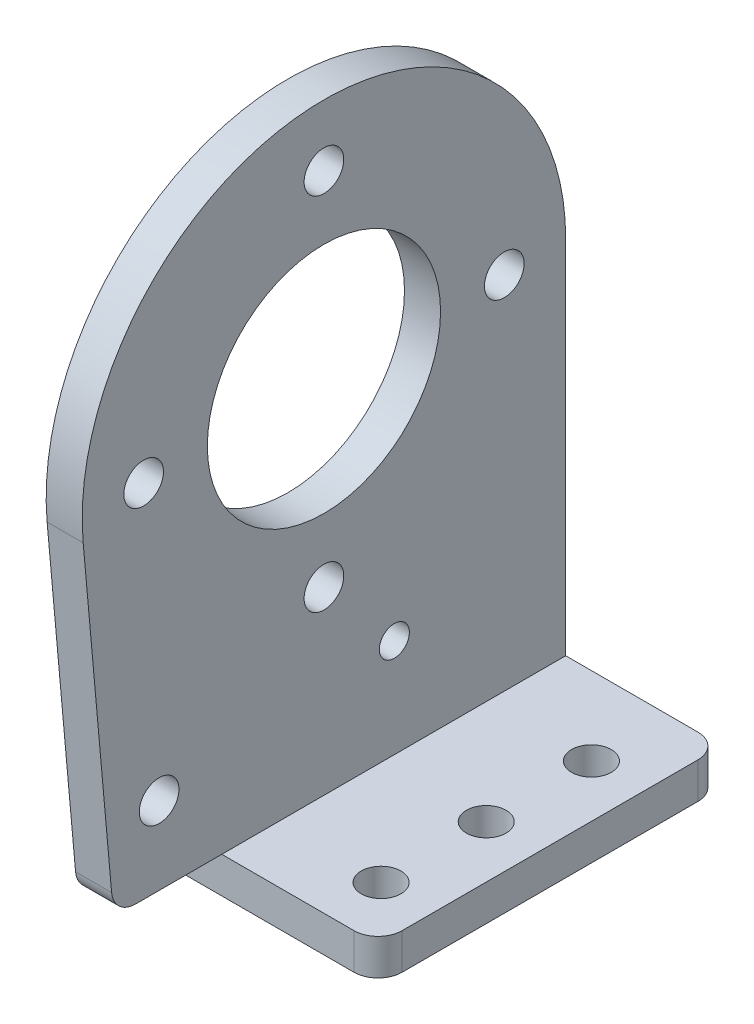
ISO-10303-21;
HEADER;
FILE_DESCRIPTION(('STEP AP214'),'2;1');
FILE_NAME('part.step','',(''),(''),'','','');
FILE_SCHEMA(('AUTOMOTIVE_DESIGN { 1 0 10303 214 1 1 1 1 }'));
ENDSEC;
DATA;
#1=APPLICATION_CONTEXT('core data for automotive mechanical design processes');
#2=APPLICATION_PROTOCOL_DEFINITION('international standard','automotive_design',2000,#1);
#3=PRODUCT_CONTEXT('',#1,'mechanical');
#4=PRODUCT('Part','Part','',(#3));
#5=PRODUCT_RELATED_PRODUCT_CATEGORY('part','',(#4));
#6=PRODUCT_DEFINITION_FORMATION('','',#4);
#7=PRODUCT_DEFINITION_CONTEXT('part definition',#1,'design');
#8=PRODUCT_DEFINITION('design','',#6,#7);
#9=PRODUCT_DEFINITION_SHAPE('','',#8);
#10=(LENGTH_UNIT() NAMED_UNIT(*) SI_UNIT(.MILLI.,.METRE.));
#11=(NAMED_UNIT(*) PLANE_ANGLE_UNIT() SI_UNIT($,.RADIAN.));
#12=(NAMED_UNIT(*) SI_UNIT($,.STERADIAN.) SOLID_ANGLE_UNIT());
#13=UNCERTAINTY_MEASURE_WITH_UNIT(LENGTH_MEASURE(1.E-05),#10,'distance_accuracy_value','');
#14=(GEOMETRIC_REPRESENTATION_CONTEXT(3) GLOBAL_UNCERTAINTY_ASSIGNED_CONTEXT((#13)) GLOBAL_UNIT_ASSIGNED_CONTEXT((#10,
#11,#12)) REPRESENTATION_CONTEXT('',''));
#15=CARTESIAN_POINT('',(0.,0.,0.));
#16=DIRECTION('',(0.,0.,1.));
#17=DIRECTION('',(1.,0.,0.));
#18=AXIS2_PLACEMENT_3D('',#15,#16,#17);
#19=CARTESIAN_POINT('',(16.,10.,0.));
#20=DIRECTION('',(0.,-1.,0.));
#21=DIRECTION('',(0.,0.,-1.));
#22=AXIS2_PLACEMENT_3D('',#19,#20,#21);
#23=PLANE('',#22);
#24=CARTESIAN_POINT('',(11.65,10.,-22.35));
#25=DIRECTION('',(0.,-1.,0.));
#26=DIRECTION('',(0.,0.,-1.));
#27=AXIS2_PLACEMENT_3D('',#24,#25,#26);
#28=CIRCLE('',#27,1.65);
#29=CARTESIAN_POINT('',(11.65,10.,-24.));
#30=VERTEX_POINT('',#29);
#31=EDGE_CURVE('E210',#30,#30,#28,.F.);
#32=ORIENTED_EDGE('',*,*,#31,.T.);
#33=EDGE_LOOP('',(#32));
#34=FACE_BOUND('',#33,.T.);
#35=CARTESIAN_POINT('',(11.65,10.,-13.6));
#36=DIRECTION('',(0.,-1.,0.));
#37=DIRECTION('',(0.,0.,-1.));
#38=AXIS2_PLACEMENT_3D('',#35,#36,#37);
#39=CIRCLE('',#38,1.65);
#40=CARTESIAN_POINT('',(11.65,10.,-15.25));
#41=VERTEX_POINT('',#40);
#42=EDGE_CURVE('E202',#41,#41,#39,.F.);
#43=ORIENTED_EDGE('',*,*,#42,.T.);
#44=EDGE_LOOP('',(#43));
#45=FACE_BOUND('',#44,.T.);
#46=DIRECTION('',(-1.,0.,0.));
#47=VECTOR('',#46,1.);
#48=CARTESIAN_POINT('',(16.,9.99999999999999,-37.61033589));
#49=LINE('',#48,#47);
#50=CARTESIAN_POINT('',(14.,9.99999999999999,-37.61033589));
#51=VERTEX_POINT('',#50);
#52=CARTESIAN_POINT('',(0.,9.99999999999999,-37.61033589));
#53=VERTEX_POINT('',#52);
#54=EDGE_CURVE('E230',#51,#53,#49,.T.);
#55=ORIENTED_EDGE('',*,*,#54,.F.);
#56=CARTESIAN_POINT('',(14.,9.99999999999999,-35.61033589));
#57=DIRECTION('',(0.,-1.,0.));
#58=DIRECTION('',(0.,0.,-1.));
#59=AXIS2_PLACEMENT_3D('',#56,#57,#58);
#60=CIRCLE('',#59,2.);
#61=CARTESIAN_POINT('',(16.,9.99999999999999,-35.61033589));
#62=VERTEX_POINT('',#61);
#63=EDGE_CURVE('E248',#51,#62,#60,.T.);
#64=ORIENTED_EDGE('',*,*,#63,.T.);
#65=DIRECTION('',(0.,0.,1.));
#66=VECTOR('',#65,1.);
#67=CARTESIAN_POINT('',(16.,10.,0.));
#68=LINE('',#67,#66);
#69=CARTESIAN_POINT('',(16.,10.,-11.));
#70=VERTEX_POINT('',#69);
#71=EDGE_CURVE('E214',#62,#70,#68,.T.);
#72=ORIENTED_EDGE('',*,*,#71,.T.);
#73=CARTESIAN_POINT('',(14.,10.,-11.));
#74=DIRECTION('',(0.,-1.,0.));
#75=DIRECTION('',(0.,0.,-1.));
#76=AXIS2_PLACEMENT_3D('',#73,#74,#75);
#77=CIRCLE('',#76,2.);
#78=CARTESIAN_POINT('',(14.,10.,-9.));
#79=VERTEX_POINT('',#78);
#80=EDGE_CURVE('E246',#70,#79,#77,.T.);
#81=ORIENTED_EDGE('',*,*,#80,.T.);
#82=DIRECTION('',(-1.,0.,0.));
#83=VECTOR('',#82,1.);
#84=CARTESIAN_POINT('',(16.,10.,-9.));
#85=LINE('',#84,#83);
#86=CARTESIAN_POINT('',(0.,10.,-9.));
#87=VERTEX_POINT('',#86);
#88=EDGE_CURVE('E232',#79,#87,#85,.T.);
#89=ORIENTED_EDGE('',*,*,#88,.T.);
#90=DIRECTION('',(0.,0.,1.));
#91=VECTOR('',#90,1.);
#92=CARTESIAN_POINT('',(0.,10.,0.));
#93=LINE('',#92,#91);
#94=EDGE_CURVE('E222',#53,#87,#93,.T.);
#95=ORIENTED_EDGE('',*,*,#94,.F.);
#96=EDGE_LOOP('',(#55,#64,#72,#81,#89,#95));
#97=FACE_BOUND('',#96,.T.);
#98=CARTESIAN_POINT('',(11.65,9.99999999999999,-31.1));
#99=DIRECTION('',(0.,-1.,0.));
#100=DIRECTION('',(0.,0.,-1.));
#101=AXIS2_PLACEMENT_3D('',#98,#99,#100);
#102=CIRCLE('',#101,1.65);
#103=CARTESIAN_POINT('',(11.65,9.99999999999999,-32.75));
#104=VERTEX_POINT('',#103);
#105=EDGE_CURVE('E207',#104,#104,#102,.T.);
#106=ORIENTED_EDGE('',*,*,#105,.F.);
#107=EDGE_LOOP('',(#106));
#108=FACE_BOUND('',#107,.T.);
#109=ADVANCED_FACE('F37',(#34,#45,#97,#108),#23,.T.);
#110=CARTESIAN_POINT('',(16.,13.,0.));
#111=DIRECTION('',(0.,1.,0.));
#112=DIRECTION('',(0.,0.,1.));
#113=AXIS2_PLACEMENT_3D('',#110,#111,#112);
#114=PLANE('',#113);
#115=DIRECTION('',(0.,0.,-1.));
#116=VECTOR('',#115,1.);
#117=CARTESIAN_POINT('',(16.,13.,0.));
#118=LINE('',#117,#116);
#119=CARTESIAN_POINT('',(16.,13.,-11.));
#120=VERTEX_POINT('',#119);
#121=CARTESIAN_POINT('',(16.,13.,-35.61033589));
#122=VERTEX_POINT('',#121);
#123=EDGE_CURVE('E217',#120,#122,#118,.T.);
#124=ORIENTED_EDGE('',*,*,#123,.T.);
#125=CARTESIAN_POINT('',(14.,13.,-35.61033589));
#126=DIRECTION('',(0.,1.,0.));
#127=DIRECTION('',(0.,0.,1.));
#128=AXIS2_PLACEMENT_3D('',#125,#126,#127);
#129=CIRCLE('',#128,2.);
#130=CARTESIAN_POINT('',(14.,13.,-37.61033589));
#131=VERTEX_POINT('',#130);
#132=EDGE_CURVE('E45',#122,#131,#129,.T.);
#133=ORIENTED_EDGE('',*,*,#132,.T.);
#134=DIRECTION('',(-1.,0.,0.));
#135=VECTOR('',#134,1.);
#136=CARTESIAN_POINT('',(16.,13.,-37.61033589));
#137=LINE('',#136,#135);
#138=CARTESIAN_POINT('',(3.,13.,-37.61033589));
#139=VERTEX_POINT('',#138);
#140=EDGE_CURVE('E228',#131,#139,#137,.T.);
#141=ORIENTED_EDGE('',*,*,#140,.T.);
#142=DIRECTION('',(0.,0.,-1.));
#143=VECTOR('',#142,1.);
#144=CARTESIAN_POINT('',(3.,13.,0.));
#145=LINE('',#144,#143);
#146=CARTESIAN_POINT('',(3.,13.,-9.));
#147=VERTEX_POINT('',#146);
#148=EDGE_CURVE('E147',#147,#139,#145,.T.);
#149=ORIENTED_EDGE('',*,*,#148,.F.);
#150=DIRECTION('',(-1.,0.,0.));
#151=VECTOR('',#150,1.);
#152=CARTESIAN_POINT('',(16.,13.,-9.));
#153=LINE('',#152,#151);
#154=CARTESIAN_POINT('',(14.,13.,-9.));
#155=VERTEX_POINT('',#154);
#156=EDGE_CURVE('E226',#155,#147,#153,.T.);
#157=ORIENTED_EDGE('',*,*,#156,.F.);
#158=CARTESIAN_POINT('',(14.,13.,-11.));
#159=DIRECTION('',(0.,1.,0.));
#160=DIRECTION('',(0.,0.,1.));
#161=AXIS2_PLACEMENT_3D('',#158,#159,#160);
#162=CIRCLE('',#161,2.);
#163=EDGE_CURVE('E52',#155,#120,#162,.T.);
#164=ORIENTED_EDGE('',*,*,#163,.T.);
#165=EDGE_LOOP('',(#124,#133,#141,#149,#157,#164));
#166=FACE_BOUND('',#165,.T.);
#167=CARTESIAN_POINT('',(11.65,13.,-22.35));
#168=DIRECTION('',(0.,-1.,0.));
#169=DIRECTION('',(0.,0.,-1.));
#170=AXIS2_PLACEMENT_3D('',#167,#168,#169);
#171=CIRCLE('',#170,1.65);
#172=CARTESIAN_POINT('',(11.65,13.,-24.));
#173=VERTEX_POINT('',#172);
#174=EDGE_CURVE('E194',#173,#173,#171,.T.);
#175=ORIENTED_EDGE('',*,*,#174,.T.);
#176=EDGE_LOOP('',(#175));
#177=FACE_BOUND('',#176,.T.);
#178=CARTESIAN_POINT('',(11.65,13.,-13.6));
#179=DIRECTION('',(0.,1.,0.));
#180=DIRECTION('',(0.,0.,1.));
#181=AXIS2_PLACEMENT_3D('',#178,#179,#180);
#182=CIRCLE('',#181,1.65);
#183=CARTESIAN_POINT('',(11.65,13.,-11.95));
#184=VERTEX_POINT('',#183);
#185=EDGE_CURVE('E199',#184,#184,#182,.F.);
#186=ORIENTED_EDGE('',*,*,#185,.T.);
#187=EDGE_LOOP('',(#186));
#188=FACE_BOUND('',#187,.T.);
#189=CARTESIAN_POINT('',(11.65,13.,-31.1));
#190=DIRECTION('',(0.,1.,0.));
#191=DIRECTION('',(0.,0.,1.));
#192=AXIS2_PLACEMENT_3D('',#189,#190,#191);
#193=CIRCLE('',#192,1.65);
#194=CARTESIAN_POINT('',(11.65,13.,-29.45));
#195=VERTEX_POINT('',#194);
#196=EDGE_CURVE('E198',#195,#195,#193,.T.);
#197=ORIENTED_EDGE('',*,*,#196,.F.);
#198=EDGE_LOOP('',(#197));
#199=FACE_BOUND('',#198,.T.);
#200=ADVANCED_FACE('F255',(#166,#177,#188,#199),#114,.T.);
#201=CARTESIAN_POINT('',(16.,0.,-9.));
#202=DIRECTION('',(0.,0.,1.));
#203=DIRECTION('',(1.,0.,0.));
#204=AXIS2_PLACEMENT_3D('',#201,#202,#203);
#205=PLANE('',#204);
#206=ORIENTED_EDGE('',*,*,#88,.F.);
#207=DIRECTION('',(0.,1.,0.));
#208=VECTOR('',#207,1.);
#209=CARTESIAN_POINT('',(14.,0.,-9.));
#210=LINE('',#209,#208);
#211=EDGE_CURVE('E11',#79,#155,#210,.T.);
#212=ORIENTED_EDGE('',*,*,#211,.T.);
#213=ORIENTED_EDGE('',*,*,#156,.T.);
#214=CARTESIAN_POINT('',(0.,13.,-9.));
#215=VERTEX_POINT('',#214);
#216=EDGE_CURVE('E219',#147,#215,#153,.T.);
#217=ORIENTED_EDGE('',*,*,#216,.T.);
#218=DIRECTION('',(0.,1.,0.));
#219=VECTOR('',#218,1.);
#220=CARTESIAN_POINT('',(0.,0.,-9.));
#221=LINE('',#220,#219);
#222=EDGE_CURVE('E213',#87,#215,#221,.T.);
#223=ORIENTED_EDGE('',*,*,#222,.F.);
#224=EDGE_LOOP('',(#206,#212,#213,#217,#223));
#225=FACE_BOUND('',#224,.T.);
#226=ADVANCED_FACE('F269',(#225),#205,.T.);
#227=CARTESIAN_POINT('',(16.,0.,-37.61033589));
#228=DIRECTION('',(0.,0.,-1.));
#229=DIRECTION('',(-1.,0.,0.));
#230=AXIS2_PLACEMENT_3D('',#227,#228,#229);
#231=PLANE('',#230);
#232=ORIENTED_EDGE('',*,*,#140,.F.);
#233=DIRECTION('',(0.,-1.,0.));
#234=VECTOR('',#233,1.);
#235=CARTESIAN_POINT('',(14.,0.,-37.61033589));
#236=LINE('',#235,#234);
#237=EDGE_CURVE('E243',#131,#51,#236,.T.);
#238=ORIENTED_EDGE('',*,*,#237,.T.);
#239=ORIENTED_EDGE('',*,*,#54,.T.);
#240=DIRECTION('',(0.,-1.,0.));
#241=VECTOR('',#240,1.);
#242=CARTESIAN_POINT('',(0.,0.,-37.61033589));
#243=LINE('',#242,#241);
#244=CARTESIAN_POINT('',(0.,42.99965258,-37.6103358895748));
#245=VERTEX_POINT('',#244);
#246=EDGE_CURVE('E126',#245,#53,#243,.T.);
#247=ORIENTED_EDGE('',*,*,#246,.F.);
#248=DIRECTION('',(-1.,0.,0.));
#249=VECTOR('',#248,1.);
#250=CARTESIAN_POINT('',(3.,42.99965258,-37.6103358895748));
#251=LINE('',#250,#249);
#252=CARTESIAN_POINT('',(3.,42.99965258,-37.6103358895748));
#253=VERTEX_POINT('',#252);
#254=EDGE_CURVE('E119',#253,#245,#251,.T.);
#255=ORIENTED_EDGE('',*,*,#254,.F.);
#256=DIRECTION('',(0.,-1.,0.));
#257=VECTOR('',#256,1.);
#258=CARTESIAN_POINT('',(3.,0.,-37.6103358895748));
#259=LINE('',#258,#257);
#260=EDGE_CURVE('E124',#253,#139,#259,.T.);
#261=ORIENTED_EDGE('',*,*,#260,.T.);
#262=EDGE_LOOP('',(#232,#238,#239,#247,#255,#261));
#263=FACE_BOUND('',#262,.T.);
#264=ADVANCED_FACE('F122',(#263),#231,.T.);
#265=CARTESIAN_POINT('',(16.,0.,0.));
#266=DIRECTION('',(1.,0.,0.));
#267=DIRECTION('',(0.,0.,-1.));
#268=AXIS2_PLACEMENT_3D('',#265,#266,#267);
#269=PLANE('',#268);
#270=ORIENTED_EDGE('',*,*,#71,.F.);
#271=DIRECTION('',(0.,-1.,0.));
#272=VECTOR('',#271,1.);
#273=CARTESIAN_POINT('',(16.,0.,-35.61033589));
#274=LINE('',#273,#272);
#275=EDGE_CURVE('E59',#62,#122,#274,.F.);
#276=ORIENTED_EDGE('',*,*,#275,.T.);
#277=ORIENTED_EDGE('',*,*,#123,.F.);
#278=DIRECTION('',(0.,1.,0.));
#279=VECTOR('',#278,1.);
#280=CARTESIAN_POINT('',(16.,0.,-11.));
#281=LINE('',#280,#279);
#282=EDGE_CURVE('E250',#120,#70,#281,.F.);
#283=ORIENTED_EDGE('',*,*,#282,.T.);
#284=EDGE_LOOP('',(#270,#276,#277,#283));
#285=FACE_BOUND('',#284,.T.);
#286=ADVANCED_FACE('F265',(#285),#269,.T.);
#287=CARTESIAN_POINT('',(0.,0.,0.));
#288=DIRECTION('',(1.,0.,0.));
#289=DIRECTION('',(0.,0.,-1.));
#290=AXIS2_PLACEMENT_3D('',#287,#288,#289);
#291=PLANE('',#290);
#292=DIRECTION('',(0.,0.,-1.));
#293=VECTOR('',#292,1.);
#294=CARTESIAN_POINT('',(0.,13.,0.));
#295=LINE('',#294,#293);
#296=CARTESIAN_POINT('',(0.,13.,-1.82859718932909));
#297=VERTEX_POINT('',#296);
#298=EDGE_CURVE('E177',#297,#215,#295,.T.);
#299=ORIENTED_EDGE('',*,*,#298,.F.);
#300=CARTESIAN_POINT('',(0.,15.,-1.82859718932909));
#301=DIRECTION('',(1.,0.,0.));
#302=DIRECTION('',(0.,0.,-1.));
#303=AXIS2_PLACEMENT_3D('',#300,#301,#302);
#304=CIRCLE('',#303,2.);
#305=CARTESIAN_POINT('',(0.,14.8212818412294,0.163401761404987));
#306=VERTEX_POINT('',#305);
#307=EDGE_CURVE('E237',#297,#306,#304,.F.);
#308=ORIENTED_EDGE('',*,*,#307,.T.);
#309=DIRECTION('',(0.,0.995999475367037,0.0893590793852966));
#310=VECTOR('',#309,1.);
#311=CARTESIAN_POINT('',(0.,0.103805585891641,-1.15702075043148));
#312=LINE('',#311,#310);
#313=CARTESIAN_POINT('',(0.,41.2025937383205,2.53028026124727));
#314=VERTEX_POINT('',#313);
#315=EDGE_CURVE('E179',#306,#314,#312,.T.);
#316=ORIENTED_EDGE('',*,*,#315,.T.);
#317=CARTESIAN_POINT('',(0.,42.99965258,-17.49980147));
#318=DIRECTION('',(-1.,0.,0.));
#319=DIRECTION('',(0.,0.,1.));
#320=AXIS2_PLACEMENT_3D('',#317,#318,#319);
#321=CIRCLE('',#320,20.1105344195748);
#322=EDGE_CURVE('E175',#245,#314,#321,.F.);
#323=ORIENTED_EDGE('',*,*,#322,.F.);
#324=ORIENTED_EDGE('',*,*,#246,.T.);
#325=ORIENTED_EDGE('',*,*,#94,.T.);
#326=ORIENTED_EDGE('',*,*,#222,.T.);
#327=EDGE_LOOP('',(#299,#308,#316,#323,#324,#325,#326));
#328=FACE_BOUND('',#327,.T.);
#329=CARTESIAN_POINT('',(0.,27.99965258,-17.49980147));
#330=DIRECTION('',(-1.,0.,0.));
#331=DIRECTION('',(0.,0.,1.));
#332=AXIS2_PLACEMENT_3D('',#329,#330,#331);
#333=CIRCLE('',#332,1.65);
#334=CARTESIAN_POINT('',(0.,27.99965258,-15.84980147));
#335=VERTEX_POINT('',#334);
#336=EDGE_CURVE('E166',#335,#335,#333,.F.);
#337=ORIENTED_EDGE('',*,*,#336,.T.);
#338=EDGE_LOOP('',(#337));
#339=FACE_BOUND('',#338,.T.);
#340=CARTESIAN_POINT('',(0.,42.99965258,-32.49980147));
#341=DIRECTION('',(-1.,0.,0.));
#342=DIRECTION('',(0.,0.,1.));
#343=AXIS2_PLACEMENT_3D('',#340,#341,#342);
#344=CIRCLE('',#343,1.65);
#345=CARTESIAN_POINT('',(0.,42.99965258,-30.84980147));
#346=VERTEX_POINT('',#345);
#347=EDGE_CURVE('E169',#346,#346,#344,.F.);
#348=ORIENTED_EDGE('',*,*,#347,.T.);
#349=EDGE_LOOP('',(#348));
#350=FACE_BOUND('',#349,.T.);
#351=CARTESIAN_POINT('',(0.,57.99965258,-17.49980147));
#352=DIRECTION('',(-1.,0.,0.));
#353=DIRECTION('',(0.,0.,1.));
#354=AXIS2_PLACEMENT_3D('',#351,#352,#353);
#355=CIRCLE('',#354,1.65);
#356=CARTESIAN_POINT('',(0.,57.99965258,-15.84980147));
#357=VERTEX_POINT('',#356);
#358=EDGE_CURVE('E172',#357,#357,#355,.F.);
#359=ORIENTED_EDGE('',*,*,#358,.T.);
#360=EDGE_LOOP('',(#359));
#361=FACE_BOUND('',#360,.T.);
#362=CARTESIAN_POINT('',(0.,42.99965258,-2.49980147));
#363=DIRECTION('',(-1.,0.,0.));
#364=DIRECTION('',(0.,0.,1.));
#365=AXIS2_PLACEMENT_3D('',#362,#363,#364);
#366=CIRCLE('',#365,1.65);
#367=CARTESIAN_POINT('',(0.,42.99965258,-0.849801470000002));
#368=VERTEX_POINT('',#367);
#369=EDGE_CURVE('E181',#368,#368,#366,.F.);
#370=ORIENTED_EDGE('',*,*,#369,.T.);
#371=EDGE_LOOP('',(#370));
#372=FACE_BOUND('',#371,.T.);
#373=CARTESIAN_POINT('',(0.,42.99965258,-17.49980147));
#374=DIRECTION('',(-1.,0.,0.));
#375=DIRECTION('',(0.,0.,1.));
#376=AXIS2_PLACEMENT_3D('',#373,#374,#375);
#377=CIRCLE('',#376,9.7);
#378=CARTESIAN_POINT('',(0.,42.99965258,-7.79980147));
#379=VERTEX_POINT('',#378);
#380=EDGE_CURVE('E184',#379,#379,#377,.F.);
#381=ORIENTED_EDGE('',*,*,#380,.T.);
#382=EDGE_LOOP('',(#381));
#383=FACE_BOUND('',#382,.T.);
#384=CARTESIAN_POINT('',(0.,21.1973949058091,-23.3549357370242));
#385=DIRECTION('',(-1.,0.,0.));
#386=DIRECTION('',(0.,0.,1.));
#387=AXIS2_PLACEMENT_3D('',#384,#385,#386);
#388=CIRCLE('',#387,1.25);
#389=CARTESIAN_POINT('',(0.,21.1973949058091,-22.1049357370242));
#390=VERTEX_POINT('',#389);
#391=EDGE_CURVE('E187',#390,#390,#388,.F.);
#392=ORIENTED_EDGE('',*,*,#391,.T.);
#393=EDGE_LOOP('',(#392));
#394=FACE_BOUND('',#393,.T.);
#395=CARTESIAN_POINT('',(0.,19.4720110444833,-3.78861061643414));
#396=DIRECTION('',(-1.,0.,0.));
#397=DIRECTION('',(0.,0.,1.));
#398=AXIS2_PLACEMENT_3D('',#395,#396,#397);
#399=CIRCLE('',#398,1.65);
#400=CARTESIAN_POINT('',(0.,19.4720110444833,-2.13861061643414));
#401=VERTEX_POINT('',#400);
#402=EDGE_CURVE('E190',#401,#401,#399,.F.);
#403=ORIENTED_EDGE('',*,*,#402,.T.);
#404=EDGE_LOOP('',(#403));
#405=FACE_BOUND('',#404,.T.);
#406=ADVANCED_FACE('F275',(#328,#339,#350,#361,#372,#383,#394,#405),#291,.F.);
#407=CARTESIAN_POINT('',(11.65,2.99999999999999,-13.6));
#408=DIRECTION('',(0.,1.,0.));
#409=DIRECTION('',(0.,0.,1.));
#410=AXIS2_PLACEMENT_3D('',#407,#408,#409);
#411=CYLINDRICAL_SURFACE('',#410,1.65);
#412=ORIENTED_EDGE('',*,*,#42,.F.);
#413=EDGE_LOOP('',(#412));
#414=FACE_BOUND('',#413,.T.);
#415=ORIENTED_EDGE('',*,*,#185,.F.);
#416=EDGE_LOOP('',(#415));
#417=FACE_BOUND('',#416,.T.);
#418=ADVANCED_FACE('F364',(#414,#417),#411,.F.);
#419=CARTESIAN_POINT('',(11.65,2.99999999999998,-31.1));
#420=DIRECTION('',(0.,1.,0.));
#421=DIRECTION('',(0.,0.,1.));
#422=AXIS2_PLACEMENT_3D('',#419,#420,#421);
#423=CYLINDRICAL_SURFACE('',#422,1.65);
#424=ORIENTED_EDGE('',*,*,#105,.T.);
#425=EDGE_LOOP('',(#424));
#426=FACE_BOUND('',#425,.T.);
#427=ORIENTED_EDGE('',*,*,#196,.T.);
#428=EDGE_LOOP('',(#427));
#429=FACE_BOUND('',#428,.T.);
#430=ADVANCED_FACE('F479',(#426,#429),#423,.F.);
#431=CARTESIAN_POINT('',(11.65,2.99999999999999,-22.35));
#432=DIRECTION('',(0.,1.,0.));
#433=DIRECTION('',(0.,0.,1.));
#434=AXIS2_PLACEMENT_3D('',#431,#432,#433);
#435=CYLINDRICAL_SURFACE('',#434,1.65);
#436=ORIENTED_EDGE('',*,*,#31,.F.);
#437=EDGE_LOOP('',(#436));
#438=FACE_BOUND('',#437,.T.);
#439=ORIENTED_EDGE('',*,*,#174,.F.);
#440=EDGE_LOOP('',(#439));
#441=FACE_BOUND('',#440,.T.);
#442=ADVANCED_FACE('F472',(#438,#441),#435,.F.);
#443=CARTESIAN_POINT('',(3.,42.99965258,-17.49980147));
#444=DIRECTION('',(-1.,0.,0.));
#445=DIRECTION('',(0.,0.,1.));
#446=AXIS2_PLACEMENT_3D('',#443,#444,#445);
#447=CYLINDRICAL_SURFACE('',#446,20.1105344195748);
#448=ORIENTED_EDGE('',*,*,#322,.T.);
#449=DIRECTION('',(-1.,0.,0.));
#450=VECTOR('',#449,1.);
#451=CARTESIAN_POINT('',(3.,41.2025937383205,2.53028026124727));
#452=LINE('',#451,#450);
#453=CARTESIAN_POINT('',(3.,41.2025937383205,2.53028026124727));
#454=VERTEX_POINT('',#453);
#455=EDGE_CURVE('E130',#454,#314,#452,.T.);
#456=ORIENTED_EDGE('',*,*,#455,.F.);
#457=CARTESIAN_POINT('',(3.,42.99965258,-17.49980147));
#458=DIRECTION('',(-1.,0.,0.));
#459=DIRECTION('',(0.,0.,1.));
#460=AXIS2_PLACEMENT_3D('',#457,#458,#459);
#461=CIRCLE('',#460,20.1105344195748);
#462=EDGE_CURVE('E135',#253,#454,#461,.F.);
#463=ORIENTED_EDGE('',*,*,#462,.F.);
#464=ORIENTED_EDGE('',*,*,#254,.T.);
#465=EDGE_LOOP('',(#448,#456,#463,#464));
#466=FACE_BOUND('',#465,.T.);
#467=ADVANCED_FACE('F136',(#466),#447,.T.);
#468=CARTESIAN_POINT('',(3.,0.103805585891641,-1.15702075043148));
#469=DIRECTION('',(0.,-0.0893590793852966,0.995999475367037));
#470=DIRECTION('',(0.,-0.995999475367037,-0.0893590793852966));
#471=AXIS2_PLACEMENT_3D('',#468,#469,#470);
#472=PLANE('',#471);
#473=ORIENTED_EDGE('',*,*,#315,.F.);
#474=DIRECTION('',(-1.,0.,0.));
#475=VECTOR('',#474,1.);
#476=CARTESIAN_POINT('',(3.,14.8212818412294,0.163401761404987));
#477=LINE('',#476,#475);
#478=CARTESIAN_POINT('',(3.,14.8212818412294,0.163401761404987));
#479=VERTEX_POINT('',#478);
#480=EDGE_CURVE('E239',#306,#479,#477,.F.);
#481=ORIENTED_EDGE('',*,*,#480,.T.);
#482=DIRECTION('',(0.,0.995999475367037,0.0893590793852966));
#483=VECTOR('',#482,1.);
#484=CARTESIAN_POINT('',(3.,0.103805585891641,-1.15702075043148));
#485=LINE('',#484,#483);
#486=EDGE_CURVE('E150',#479,#454,#485,.T.);
#487=ORIENTED_EDGE('',*,*,#486,.T.);
#488=ORIENTED_EDGE('',*,*,#455,.T.);
#489=EDGE_LOOP('',(#473,#481,#487,#488));
#490=FACE_BOUND('',#489,.T.);
#491=ADVANCED_FACE('F280',(#490),#472,.T.);
#492=CARTESIAN_POINT('',(3.,13.,0.));
#493=DIRECTION('',(0.,1.,0.));
#494=DIRECTION('',(0.,0.,1.));
#495=AXIS2_PLACEMENT_3D('',#492,#493,#494);
#496=PLANE('',#495);
#497=CARTESIAN_POINT('',(3.,13.,-1.82859718932909));
#498=VERTEX_POINT('',#497);
#499=EDGE_CURVE('E148',#498,#147,#145,.T.);
#500=ORIENTED_EDGE('',*,*,#499,.F.);
#501=DIRECTION('',(-1.,0.,0.));
#502=VECTOR('',#501,1.);
#503=CARTESIAN_POINT('',(0.,13.,-1.82859718932909));
#504=LINE('',#503,#502);
#505=EDGE_CURVE('E234',#498,#297,#504,.T.);
#506=ORIENTED_EDGE('',*,*,#505,.T.);
#507=ORIENTED_EDGE('',*,*,#298,.T.);
#508=ORIENTED_EDGE('',*,*,#216,.F.);
#509=EDGE_LOOP('',(#500,#506,#507,#508));
#510=FACE_BOUND('',#509,.T.);
#511=ADVANCED_FACE('F287',(#510),#496,.F.);
#512=CARTESIAN_POINT('',(3.,21.1973949058091,-23.3549357370242));
#513=DIRECTION('',(-1.,0.,0.));
#514=DIRECTION('',(0.,0.,1.));
#515=AXIS2_PLACEMENT_3D('',#512,#513,#514);
#516=CYLINDRICAL_SURFACE('',#515,1.25);
#517=CARTESIAN_POINT('',(3.,21.1973949058091,-23.3549357370242));
#518=DIRECTION('',(-1.,0.,0.));
#519=DIRECTION('',(0.,0.,1.));
#520=AXIS2_PLACEMENT_3D('',#517,#518,#519);
#521=CIRCLE('',#520,1.25);
#522=CARTESIAN_POINT('',(3.,21.1973949058091,-22.1049357370242));
#523=VERTEX_POINT('',#522);
#524=EDGE_CURVE('E161',#523,#523,#521,.F.);
#525=ORIENTED_EDGE('',*,*,#524,.T.);
#526=EDGE_LOOP('',(#525));
#527=FACE_BOUND('',#526,.T.);
#528=ORIENTED_EDGE('',*,*,#391,.F.);
#529=EDGE_LOOP('',(#528));
#530=FACE_BOUND('',#529,.T.);
#531=ADVANCED_FACE('F289',(#527,#530),#516,.F.);
#532=CARTESIAN_POINT('',(3.,42.99965258,-17.49980147));
#533=DIRECTION('',(-1.,0.,0.));
#534=DIRECTION('',(0.,0.,1.));
#535=AXIS2_PLACEMENT_3D('',#532,#533,#534);
#536=CYLINDRICAL_SURFACE('',#535,9.7);
#537=CARTESIAN_POINT('',(3.,42.99965258,-17.49980147));
#538=DIRECTION('',(-1.,0.,0.));
#539=DIRECTION('',(0.,0.,1.));
#540=AXIS2_PLACEMENT_3D('',#537,#538,#539);
#541=CIRCLE('',#540,9.7);
#542=CARTESIAN_POINT('',(3.,42.99965258,-7.79980147));
#543=VERTEX_POINT('',#542);
#544=EDGE_CURVE('E158',#543,#543,#541,.F.);
#545=ORIENTED_EDGE('',*,*,#544,.T.);
#546=EDGE_LOOP('',(#545));
#547=FACE_BOUND('',#546,.T.);
#548=ORIENTED_EDGE('',*,*,#380,.F.);
#549=EDGE_LOOP('',(#548));
#550=FACE_BOUND('',#549,.T.);
#551=ADVANCED_FACE('F295',(#547,#550),#536,.F.);
#552=CARTESIAN_POINT('',(3.,42.99965258,-2.49980147));
#553=DIRECTION('',(-1.,0.,0.));
#554=DIRECTION('',(0.,0.,1.));
#555=AXIS2_PLACEMENT_3D('',#552,#553,#554);
#556=CYLINDRICAL_SURFACE('',#555,1.65);
#557=CARTESIAN_POINT('',(3.,42.99965258,-2.49980147));
#558=DIRECTION('',(-1.,0.,0.));
#559=DIRECTION('',(0.,0.,1.));
#560=AXIS2_PLACEMENT_3D('',#557,#558,#559);
#561=CIRCLE('',#560,1.65);
#562=CARTESIAN_POINT('',(3.,42.99965258,-0.849801470000002));
#563=VERTEX_POINT('',#562);
#564=EDGE_CURVE('E155',#563,#563,#561,.F.);
#565=ORIENTED_EDGE('',*,*,#564,.T.);
#566=EDGE_LOOP('',(#565));
#567=FACE_BOUND('',#566,.T.);
#568=ORIENTED_EDGE('',*,*,#369,.F.);
#569=EDGE_LOOP('',(#568));
#570=FACE_BOUND('',#569,.T.);
#571=ADVANCED_FACE('F441',(#567,#570),#556,.F.);
#572=CARTESIAN_POINT('',(3.,57.99965258,-17.49980147));
#573=DIRECTION('',(-1.,0.,0.));
#574=DIRECTION('',(0.,0.,1.));
#575=AXIS2_PLACEMENT_3D('',#572,#573,#574);
#576=CYLINDRICAL_SURFACE('',#575,1.65);
#577=CARTESIAN_POINT('',(3.,57.99965258,-17.49980147));
#578=DIRECTION('',(-1.,0.,0.));
#579=DIRECTION('',(0.,0.,1.));
#580=AXIS2_PLACEMENT_3D('',#577,#578,#579);
#581=CIRCLE('',#580,1.65);
#582=CARTESIAN_POINT('',(3.,57.99965258,-15.84980147));
#583=VERTEX_POINT('',#582);
#584=EDGE_CURVE('E140',#583,#583,#581,.F.);
#585=ORIENTED_EDGE('',*,*,#584,.T.);
#586=EDGE_LOOP('',(#585));
#587=FACE_BOUND('',#586,.T.);
#588=ORIENTED_EDGE('',*,*,#358,.F.);
#589=EDGE_LOOP('',(#588));
#590=FACE_BOUND('',#589,.T.);
#591=ADVANCED_FACE('F431',(#587,#590),#576,.F.);
#592=CARTESIAN_POINT('',(3.,42.99965258,-32.49980147));
#593=DIRECTION('',(-1.,0.,0.));
#594=DIRECTION('',(0.,0.,1.));
#595=AXIS2_PLACEMENT_3D('',#592,#593,#594);
#596=CYLINDRICAL_SURFACE('',#595,1.65);
#597=CARTESIAN_POINT('',(3.,42.99965258,-32.49980147));
#598=DIRECTION('',(-1.,0.,0.));
#599=DIRECTION('',(0.,0.,1.));
#600=AXIS2_PLACEMENT_3D('',#597,#598,#599);
#601=CIRCLE('',#600,1.65);
#602=CARTESIAN_POINT('',(3.,42.99965258,-30.84980147));
#603=VERTEX_POINT('',#602);
#604=EDGE_CURVE('E536',#603,#603,#601,.F.);
#605=ORIENTED_EDGE('',*,*,#604,.T.);
#606=EDGE_LOOP('',(#605));
#607=FACE_BOUND('',#606,.T.);
#608=ORIENTED_EDGE('',*,*,#347,.F.);
#609=EDGE_LOOP('',(#608));
#610=FACE_BOUND('',#609,.T.);
#611=ADVANCED_FACE('F421',(#607,#610),#596,.F.);
#612=CARTESIAN_POINT('',(3.,27.99965258,-17.49980147));
#613=DIRECTION('',(-1.,0.,0.));
#614=DIRECTION('',(0.,0.,1.));
#615=AXIS2_PLACEMENT_3D('',#612,#613,#614);
#616=CYLINDRICAL_SURFACE('',#615,1.65);
#617=CARTESIAN_POINT('',(3.,27.99965258,-17.49980147));
#618=DIRECTION('',(-1.,0.,0.));
#619=DIRECTION('',(0.,0.,1.));
#620=AXIS2_PLACEMENT_3D('',#617,#618,#619);
#621=CIRCLE('',#620,1.65);
#622=CARTESIAN_POINT('',(3.,27.99965258,-15.84980147));
#623=VERTEX_POINT('',#622);
#624=EDGE_CURVE('E193',#623,#623,#621,.F.);
#625=ORIENTED_EDGE('',*,*,#624,.T.);
#626=EDGE_LOOP('',(#625));
#627=FACE_BOUND('',#626,.T.);
#628=ORIENTED_EDGE('',*,*,#336,.F.);
#629=EDGE_LOOP('',(#628));
#630=FACE_BOUND('',#629,.T.);
#631=ADVANCED_FACE('F410',(#627,#630),#616,.F.);
#632=CARTESIAN_POINT('',(3.,19.4720110444833,-3.78861061643414));
#633=DIRECTION('',(-1.,0.,0.));
#634=DIRECTION('',(0.,0.,1.));
#635=AXIS2_PLACEMENT_3D('',#632,#633,#634);
#636=CYLINDRICAL_SURFACE('',#635,1.65);
#637=CARTESIAN_POINT('',(3.,19.4720110444833,-3.78861061643414));
#638=DIRECTION('',(-1.,0.,0.));
#639=DIRECTION('',(0.,0.,1.));
#640=AXIS2_PLACEMENT_3D('',#637,#638,#639);
#641=CIRCLE('',#640,1.65);
#642=CARTESIAN_POINT('',(3.,19.4720110444833,-2.13861061643414));
#643=VERTEX_POINT('',#642);
#644=EDGE_CURVE('E131',#643,#643,#641,.F.);
#645=ORIENTED_EDGE('',*,*,#644,.T.);
#646=EDGE_LOOP('',(#645));
#647=FACE_BOUND('',#646,.T.);
#648=ORIENTED_EDGE('',*,*,#402,.F.);
#649=EDGE_LOOP('',(#648));
#650=FACE_BOUND('',#649,.T.);
#651=ADVANCED_FACE('F337',(#647,#650),#636,.F.);
#652=CARTESIAN_POINT('',(3.,0.,0.));
#653=DIRECTION('',(-1.,0.,0.));
#654=DIRECTION('',(0.,0.,1.));
#655=AXIS2_PLACEMENT_3D('',#652,#653,#654);
#656=PLANE('',#655);
#657=ORIENTED_EDGE('',*,*,#624,.F.);
#658=EDGE_LOOP('',(#657));
#659=FACE_BOUND('',#658,.T.);
#660=ORIENTED_EDGE('',*,*,#604,.F.);
#661=EDGE_LOOP('',(#660));
#662=FACE_BOUND('',#661,.T.);
#663=ORIENTED_EDGE('',*,*,#584,.F.);
#664=EDGE_LOOP('',(#663));
#665=FACE_BOUND('',#664,.T.);
#666=ORIENTED_EDGE('',*,*,#486,.F.);
#667=CARTESIAN_POINT('',(3.,15.,-1.82859718932909));
#668=DIRECTION('',(-1.,0.,0.));
#669=DIRECTION('',(0.,0.,1.));
#670=AXIS2_PLACEMENT_3D('',#667,#668,#669);
#671=CIRCLE('',#670,2.);
#672=EDGE_CURVE('E241',#479,#498,#671,.F.);
#673=ORIENTED_EDGE('',*,*,#672,.T.);
#674=ORIENTED_EDGE('',*,*,#499,.T.);
#675=ORIENTED_EDGE('',*,*,#148,.T.);
#676=ORIENTED_EDGE('',*,*,#260,.F.);
#677=ORIENTED_EDGE('',*,*,#462,.T.);
#678=EDGE_LOOP('',(#666,#673,#674,#675,#676,#677));
#679=FACE_BOUND('',#678,.T.);
#680=ORIENTED_EDGE('',*,*,#564,.F.);
#681=EDGE_LOOP('',(#680));
#682=FACE_BOUND('',#681,.T.);
#683=ORIENTED_EDGE('',*,*,#544,.F.);
#684=EDGE_LOOP('',(#683));
#685=FACE_BOUND('',#684,.T.);
#686=ORIENTED_EDGE('',*,*,#524,.F.);
#687=EDGE_LOOP('',(#686));
#688=FACE_BOUND('',#687,.T.);
#689=ORIENTED_EDGE('',*,*,#644,.F.);
#690=EDGE_LOOP('',(#689));
#691=FACE_BOUND('',#690,.T.);
#692=ADVANCED_FACE('F143',(#659,#662,#665,#679,#682,#685,#688,#691),#656,.F.);
#693=CARTESIAN_POINT('',(3.,15.,-1.82859718932909));
#694=DIRECTION('',(1.,0.,0.));
#695=DIRECTION('',(0.,0.,-1.));
#696=AXIS2_PLACEMENT_3D('',#693,#694,#695);
#697=CYLINDRICAL_SURFACE('',#696,2.);
#698=ORIENTED_EDGE('',*,*,#672,.F.);
#699=ORIENTED_EDGE('',*,*,#480,.F.);
#700=ORIENTED_EDGE('',*,*,#307,.F.);
#701=ORIENTED_EDGE('',*,*,#505,.F.);
#702=EDGE_LOOP('',(#698,#699,#700,#701));
#703=FACE_BOUND('',#702,.T.);
#704=ADVANCED_FACE('F285',(#703),#697,.T.);
#705=CARTESIAN_POINT('',(14.,0.,-35.61033589));
#706=DIRECTION('',(0.,-1.,0.));
#707=DIRECTION('',(0.,0.,-1.));
#708=AXIS2_PLACEMENT_3D('',#705,#706,#707);
#709=CYLINDRICAL_SURFACE('',#708,2.);
#710=ORIENTED_EDGE('',*,*,#132,.F.);
#711=ORIENTED_EDGE('',*,*,#275,.F.);
#712=ORIENTED_EDGE('',*,*,#63,.F.);
#713=ORIENTED_EDGE('',*,*,#237,.F.);
#714=EDGE_LOOP('',(#710,#711,#712,#713));
#715=FACE_BOUND('',#714,.T.);
#716=ADVANCED_FACE('F260',(#715),#709,.T.);
#717=CARTESIAN_POINT('',(14.,0.,-11.));
#718=DIRECTION('',(0.,1.,0.));
#719=DIRECTION('',(0.,0.,1.));
#720=AXIS2_PLACEMENT_3D('',#717,#718,#719);
#721=CYLINDRICAL_SURFACE('',#720,2.);
#722=ORIENTED_EDGE('',*,*,#80,.F.);
#723=ORIENTED_EDGE('',*,*,#282,.F.);
#724=ORIENTED_EDGE('',*,*,#163,.F.);
#725=ORIENTED_EDGE('',*,*,#211,.F.);
#726=EDGE_LOOP('',(#722,#723,#724,#725));
#727=FACE_BOUND('',#726,.T.);
#728=ADVANCED_FACE('F39',(#727),#721,.T.);
#729=CLOSED_SHELL('',(#109,#200,#226,#264,#286,#406,#418,#430,#442,#467,#491,#511,#531,#551,
#571,#591,#611,#631,#651,#692,#704,#716,#728));
#730=MANIFOLD_SOLID_BREP('B2',#729);
#731=ADVANCED_BREP_SHAPE_REPRESENTATION('',(#18,#730),#14);
#732=SHAPE_DEFINITION_REPRESENTATION(#9,#731);
ENDSEC;
END-ISO-10303-21;
